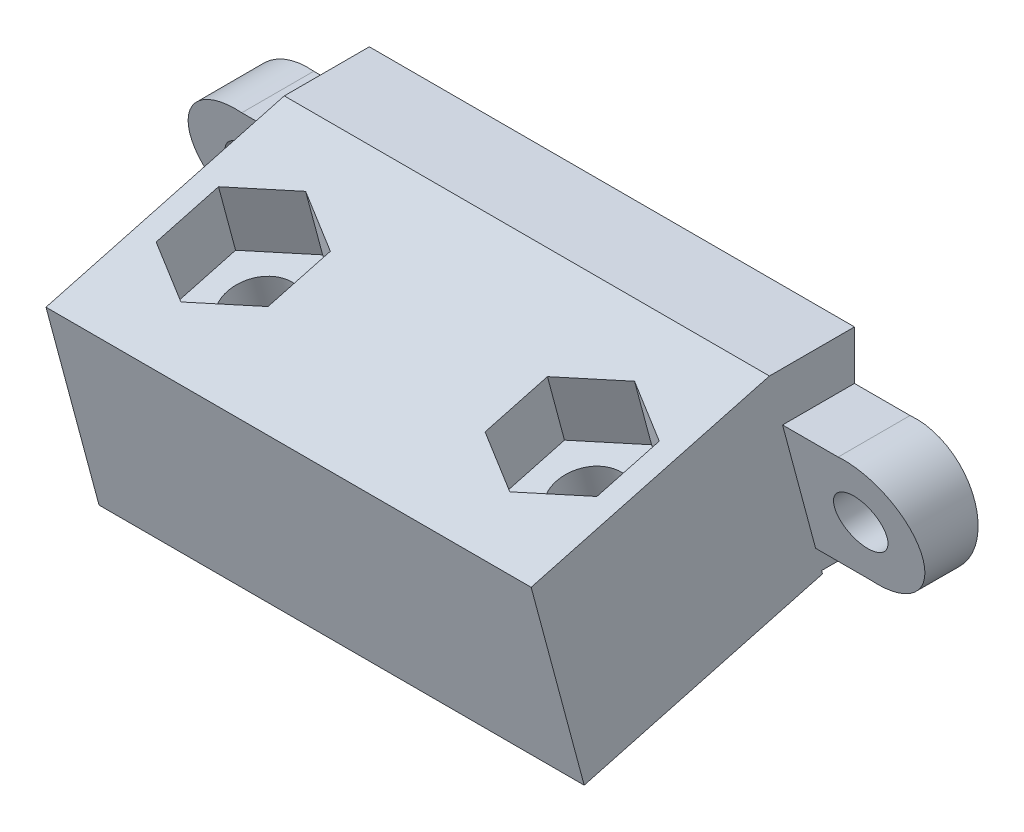
ISO-10303-21;
HEADER;
FILE_DESCRIPTION(('STEP AP214'),'2;1');
FILE_NAME('part.step','',(''),(''),'','','');
FILE_SCHEMA(('AUTOMOTIVE_DESIGN { 1 0 10303 214 1 1 1 1 }'));
ENDSEC;
DATA;
#1=APPLICATION_CONTEXT('core data for automotive mechanical design processes');
#2=APPLICATION_PROTOCOL_DEFINITION('international standard','automotive_design',2000,#1);
#3=PRODUCT_CONTEXT('',#1,'mechanical');
#4=PRODUCT('Part','Part','',(#3));
#5=PRODUCT_RELATED_PRODUCT_CATEGORY('part','',(#4));
#6=PRODUCT_DEFINITION_FORMATION('','',#4);
#7=PRODUCT_DEFINITION_CONTEXT('part definition',#1,'design');
#8=PRODUCT_DEFINITION('design','',#6,#7);
#9=PRODUCT_DEFINITION_SHAPE('','',#8);
#10=(LENGTH_UNIT() NAMED_UNIT(*) SI_UNIT(.MILLI.,.METRE.));
#11=(NAMED_UNIT(*) PLANE_ANGLE_UNIT() SI_UNIT($,.RADIAN.));
#12=(NAMED_UNIT(*) SI_UNIT($,.STERADIAN.) SOLID_ANGLE_UNIT());
#13=UNCERTAINTY_MEASURE_WITH_UNIT(LENGTH_MEASURE(1.E-05),#10,'distance_accuracy_value','');
#14=(GEOMETRIC_REPRESENTATION_CONTEXT(3) GLOBAL_UNCERTAINTY_ASSIGNED_CONTEXT((#13)) GLOBAL_UNIT_ASSIGNED_CONTEXT((#10,
#11,#12)) REPRESENTATION_CONTEXT('',''));
#15=CARTESIAN_POINT('',(0.,0.,0.));
#16=DIRECTION('',(0.,0.,1.));
#17=DIRECTION('',(1.,0.,0.));
#18=AXIS2_PLACEMENT_3D('',#15,#16,#17);
#19=CARTESIAN_POINT('',(-4.75000000000006,10.2662464495213,12.2025071457582));
#20=DIRECTION('',(0.,-0.965925826289068,-0.25881904510252));
#21=DIRECTION('',(0.,0.25881904510252,-0.965925826289068));
#22=AXIS2_PLACEMENT_3D('',#19,#20,#21);
#23=CYLINDRICAL_SURFACE('',#22,2.);
#24=CARTESIAN_POINT('',(-4.75000000000005,-0.97536344832324,9.19032685200501));
#25=DIRECTION('',(0.,0.965925826289068,0.25881904510252));
#26=DIRECTION('',(0.,-0.25881904510252,0.965925826289068));
#27=AXIS2_PLACEMENT_3D('',#24,#25,#26);
#28=CIRCLE('',#27,2.);
#29=CARTESIAN_POINT('',(-4.75000000000005,-1.49300153852828,11.1221785045831));
#30=VERTEX_POINT('',#29);
#31=EDGE_CURVE('E331',#30,#30,#28,.T.);
#32=ORIENTED_EDGE('',*,*,#31,.F.);
#33=EDGE_LOOP('',(#32));
#34=FACE_BOUND('',#33,.T.);
#35=CARTESIAN_POINT('',(-4.75000000000005,7.19515385657483,11.379610365597));
#36=DIRECTION('',(0.,0.965925826289068,0.25881904510252));
#37=DIRECTION('',(0.,-0.25881904510252,0.965925826289069));
#38=AXIS2_PLACEMENT_3D('',#35,#36,#37);
#39=CIRCLE('',#38,2.);
#40=CARTESIAN_POINT('',(-4.75000000000005,6.67751576636979,13.3114620181751));
#41=VERTEX_POINT('',#40);
#42=EDGE_CURVE('E40',#41,#41,#39,.T.);
#43=ORIENTED_EDGE('',*,*,#42,.T.);
#44=EDGE_LOOP('',(#43));
#45=FACE_BOUND('',#44,.T.);
#46=ADVANCED_FACE('F36',(#34,#45),#23,.F.);
#47=CARTESIAN_POINT('',(-24.7500000000001,10.2662464495213,12.2025071457582));
#48=DIRECTION('',(0.,-0.965925826289068,-0.25881904510252));
#49=DIRECTION('',(0.,0.25881904510252,-0.965925826289068));
#50=AXIS2_PLACEMENT_3D('',#47,#48,#49);
#51=CYLINDRICAL_SURFACE('',#50,2.);
#52=CARTESIAN_POINT('',(-24.7500000000001,-0.975363448323251,9.19032685200501));
#53=DIRECTION('',(0.,0.965925826289068,0.25881904510252));
#54=DIRECTION('',(0.,-0.25881904510252,0.965925826289068));
#55=AXIS2_PLACEMENT_3D('',#52,#53,#54);
#56=CIRCLE('',#55,2.);
#57=CARTESIAN_POINT('',(-24.7500000000001,-1.49300153852829,11.1221785045831));
#58=VERTEX_POINT('',#57);
#59=EDGE_CURVE('E328',#58,#58,#56,.T.);
#60=ORIENTED_EDGE('',*,*,#59,.F.);
#61=EDGE_LOOP('',(#60));
#62=FACE_BOUND('',#61,.T.);
#63=CARTESIAN_POINT('',(-24.7500000000001,7.19515385657482,11.379610365597));
#64=DIRECTION('',(0.,0.965925826289068,0.258819045102521));
#65=DIRECTION('',(0.,-0.258819045102521,0.965925826289068));
#66=AXIS2_PLACEMENT_3D('',#63,#64,#65);
#67=CIRCLE('',#66,2.);
#68=CARTESIAN_POINT('',(-24.7500000000001,6.67751576636978,13.3114620181751));
#69=VERTEX_POINT('',#68);
#70=EDGE_CURVE('E266',#69,#69,#67,.T.);
#71=ORIENTED_EDGE('',*,*,#70,.T.);
#72=EDGE_LOOP('',(#71));
#73=FACE_BOUND('',#72,.T.);
#74=ADVANCED_FACE('F464',(#62,#73),#51,.F.);
#75=CARTESIAN_POINT('',(0.,12.2073892877903,4.95806344859016));
#76=DIRECTION('',(0.,-0.25881904510252,0.965925826289068));
#77=DIRECTION('',(0.,-0.965925826289068,-0.25881904510252));
#78=AXIS2_PLACEMENT_3D('',#75,#76,#77);
#79=PLANE('',#78);
#80=DIRECTION('',(0.,-0.965925826289068,-0.25881904510252));
#81=VECTOR('',#80,1.);
#82=CARTESIAN_POINT('',(-29.5000000000001,12.2073892877902,4.95806344859015));
#83=LINE('',#82,#81);
#84=CARTESIAN_POINT('',(-29.5000000000001,10.0231235315044,4.37279120313842));
#85=VERTEX_POINT('',#84);
#86=CARTESIAN_POINT('',(-29.5000000000001,2.52312353150436,2.36317225990499));
#87=VERTEX_POINT('',#86);
#88=EDGE_CURVE('E11',#85,#87,#83,.T.);
#89=ORIENTED_EDGE('',*,*,#88,.F.);
#90=DIRECTION('',(-1.,0.,0.));
#91=VECTOR('',#90,1.);
#92=CARTESIAN_POINT('',(-32.88,10.0231235315044,4.3727912031384));
#93=LINE('',#92,#91);
#94=CARTESIAN_POINT('',(-32.88,10.0231235315044,4.3727912031384));
#95=VERTEX_POINT('',#94);
#96=EDGE_CURVE('E365',#85,#95,#93,.T.);
#97=ORIENTED_EDGE('',*,*,#96,.T.);
#98=CARTESIAN_POINT('',(-33.2500000000001,6.27312353150437,3.3679817315217));
#99=DIRECTION('',(0.,-0.25881904510252,0.965925826289068));
#100=DIRECTION('',(0.,-0.965925826289068,-0.25881904510252));
#101=AXIS2_PLACEMENT_3D('',#98,#99,#100);
#102=ELLIPSE('',#101,3.90113714857937,3.76820912370851);
#103=CARTESIAN_POINT('',(-32.88,2.52312353150437,2.363172259905));
#104=VERTEX_POINT('',#103);
#105=EDGE_CURVE('E362',#95,#104,#102,.T.);
#106=ORIENTED_EDGE('',*,*,#105,.T.);
#107=DIRECTION('',(1.,0.,0.));
#108=VECTOR('',#107,1.);
#109=CARTESIAN_POINT('',(-29.5000000000001,2.52312353150436,2.36317225990499));
#110=LINE('',#109,#108);
#111=EDGE_CURVE('E359',#104,#87,#110,.T.);
#112=ORIENTED_EDGE('',*,*,#111,.T.);
#113=EDGE_LOOP('',(#89,#97,#106,#112));
#114=FACE_BOUND('',#113,.T.);
#115=CARTESIAN_POINT('',(-33.2500000000001,6.27312353150437,3.3679817315217));
#116=DIRECTION('',(0.,-0.25881904510252,0.965925826289068));
#117=DIRECTION('',(0.,-0.965925826289068,-0.25881904510252));
#118=AXIS2_PLACEMENT_3D('',#115,#116,#117);
#119=ELLIPSE('',#118,1.65644188865612,1.59999999999999);
#120=CARTESIAN_POINT('',(-33.2500000000001,4.67312353150438,2.9392630236319));
#121=VERTEX_POINT('',#120);
#122=EDGE_CURVE('E353',#121,#121,#119,.T.);
#123=ORIENTED_EDGE('',*,*,#122,.F.);
#124=EDGE_LOOP('',(#123));
#125=FACE_BOUND('',#124,.T.);
#126=ADVANCED_FACE('F470',(#114,#125),#79,.T.);
#127=CARTESIAN_POINT('',(3.74999999999994,6.27312353150435,3.36798173152169));
#128=DIRECTION('',(0.,-0.25881904510252,0.965925826289068));
#129=DIRECTION('',(0.,-0.965925826289068,-0.25881904510252));
#130=AXIS2_PLACEMENT_3D('',#127,#128,#129);
#131=ELLIPSE('',#130,1.65644188865612,1.59999999999999);
#132=CARTESIAN_POINT('',(3.74999999999994,4.67312353150437,2.9392630236319));
#133=VERTEX_POINT('',#132);
#134=EDGE_CURVE('E352',#133,#133,#131,.T.);
#135=ORIENTED_EDGE('',*,*,#134,.F.);
#136=EDGE_LOOP('',(#135));
#137=FACE_BOUND('',#136,.T.);
#138=DIRECTION('',(-1.,0.,0.));
#139=VECTOR('',#138,1.);
#140=CARTESIAN_POINT('',(0.,10.0231235315044,4.3727912031384));
#141=LINE('',#140,#139);
#142=CARTESIAN_POINT('',(3.3799999999999,10.0231235315044,4.37279120313841));
#143=VERTEX_POINT('',#142);
#144=CARTESIAN_POINT('',(0.,10.0231235315044,4.3727912031384));
#145=VERTEX_POINT('',#144);
#146=EDGE_CURVE('E371',#143,#145,#141,.T.);
#147=ORIENTED_EDGE('',*,*,#146,.T.);
#148=DIRECTION('',(0.,-0.965925826289068,-0.25881904510252));
#149=VECTOR('',#148,1.);
#150=CARTESIAN_POINT('',(0.,12.2073892877903,4.95806344859016));
#151=LINE('',#150,#149);
#152=CARTESIAN_POINT('',(0.,2.52312353150435,2.36317225990498));
#153=VERTEX_POINT('',#152);
#154=EDGE_CURVE('E45',#145,#153,#151,.T.);
#155=ORIENTED_EDGE('',*,*,#154,.T.);
#156=DIRECTION('',(1.,0.,0.));
#157=VECTOR('',#156,1.);
#158=CARTESIAN_POINT('',(3.37999999999987,2.52312353150435,2.36317225990498));
#159=LINE('',#158,#157);
#160=CARTESIAN_POINT('',(3.37999999999988,2.52312353150435,2.36317225990498));
#161=VERTEX_POINT('',#160);
#162=EDGE_CURVE('E356',#153,#161,#159,.T.);
#163=ORIENTED_EDGE('',*,*,#162,.T.);
#164=CARTESIAN_POINT('',(3.74999999999994,6.27312353150435,3.36798173152169));
#165=DIRECTION('',(0.,-0.25881904510252,0.965925826289068));
#166=DIRECTION('',(0.,-0.965925826289068,-0.25881904510252));
#167=AXIS2_PLACEMENT_3D('',#164,#165,#166);
#168=ELLIPSE('',#167,3.90113714857937,3.76820912370851);
#169=EDGE_CURVE('E374',#161,#143,#168,.T.);
#170=ORIENTED_EDGE('',*,*,#169,.T.);
#171=EDGE_LOOP('',(#147,#155,#163,#170));
#172=FACE_BOUND('',#171,.T.);
#173=ADVANCED_FACE('F492',(#137,#172),#79,.T.);
#174=CARTESIAN_POINT('',(3.74999999999994,6.27312353150435,0.));
#175=DIRECTION('',(0.,0.,-1.));
#176=DIRECTION('',(-1.,0.,0.));
#177=AXIS2_PLACEMENT_3D('',#174,#175,#176);
#178=PLANE('',#177);
#179=CARTESIAN_POINT('',(-33.2500000000001,6.27312353150437,0.));
#180=DIRECTION('',(0.,0.,1.));
#181=DIRECTION('',(1.,0.,0.));
#182=AXIS2_PLACEMENT_3D('',#179,#180,#181);
#183=CIRCLE('',#182,1.59999999999999);
#184=CARTESIAN_POINT('',(-31.6500000000001,6.27312353150437,0.));
#185=VERTEX_POINT('',#184);
#186=EDGE_CURVE('E382',#185,#185,#183,.T.);
#187=ORIENTED_EDGE('',*,*,#186,.T.);
#188=EDGE_LOOP('',(#187));
#189=FACE_BOUND('',#188,.T.);
#190=CARTESIAN_POINT('',(3.74999999999994,6.27312353150435,0.));
#191=DIRECTION('',(0.,0.,1.));
#192=DIRECTION('',(-1.,0.,0.));
#193=AXIS2_PLACEMENT_3D('',#190,#191,#192);
#194=CIRCLE('',#193,3.76820912370851);
#195=CARTESIAN_POINT('',(3.37999999999988,2.52312353150435,0.));
#196=VERTEX_POINT('',#195);
#197=CARTESIAN_POINT('',(3.3799999999999,10.0231235315044,0.));
#198=VERTEX_POINT('',#197);
#199=EDGE_CURVE('E385',#196,#198,#194,.T.);
#200=ORIENTED_EDGE('',*,*,#199,.F.);
#201=DIRECTION('',(1.,0.,0.));
#202=VECTOR('',#201,1.);
#203=CARTESIAN_POINT('',(3.37999999999988,2.52312353150435,0.));
#204=LINE('',#203,#202);
#205=CARTESIAN_POINT('',(0.,2.52312353150435,0.));
#206=VERTEX_POINT('',#205);
#207=EDGE_CURVE('E390',#206,#196,#204,.T.);
#208=ORIENTED_EDGE('',*,*,#207,.F.);
#209=DIRECTION('',(0.,1.,0.));
#210=VECTOR('',#209,1.);
#211=CARTESIAN_POINT('',(0.,2.52312353150435,0.));
#212=LINE('',#211,#210);
#213=CARTESIAN_POINT('',(0.,1.16774620563937,0.));
#214=VERTEX_POINT('',#213);
#215=EDGE_CURVE('E411',#214,#206,#212,.T.);
#216=ORIENTED_EDGE('',*,*,#215,.F.);
#217=DIRECTION('',(1.,0.,0.));
#218=VECTOR('',#217,1.);
#219=CARTESIAN_POINT('',(0.,1.16774620563937,0.));
#220=LINE('',#219,#218);
#221=CARTESIAN_POINT('',(-29.5000000000001,1.16774620563936,0.));
#222=VERTEX_POINT('',#221);
#223=EDGE_CURVE('E409',#222,#214,#220,.T.);
#224=ORIENTED_EDGE('',*,*,#223,.F.);
#225=DIRECTION('',(0.,-1.,0.));
#226=VECTOR('',#225,1.);
#227=CARTESIAN_POINT('',(-29.5000000000001,1.16774620563936,0.));
#228=LINE('',#227,#226);
#229=CARTESIAN_POINT('',(-29.5000000000001,2.52312353150436,0.));
#230=VERTEX_POINT('',#229);
#231=EDGE_CURVE('E407',#230,#222,#228,.T.);
#232=ORIENTED_EDGE('',*,*,#231,.F.);
#233=DIRECTION('',(1.,0.,0.));
#234=VECTOR('',#233,1.);
#235=CARTESIAN_POINT('',(-29.5000000000001,2.52312353150436,0.));
#236=LINE('',#235,#234);
#237=CARTESIAN_POINT('',(-32.88,2.52312353150437,0.));
#238=VERTEX_POINT('',#237);
#239=EDGE_CURVE('E405',#238,#230,#236,.T.);
#240=ORIENTED_EDGE('',*,*,#239,.F.);
#241=CARTESIAN_POINT('',(-33.2500000000001,6.27312353150437,0.));
#242=DIRECTION('',(0.,0.,1.));
#243=DIRECTION('',(1.,0.,0.));
#244=AXIS2_PLACEMENT_3D('',#241,#242,#243);
#245=CIRCLE('',#244,3.76820912370851);
#246=CARTESIAN_POINT('',(-32.88,10.0231235315044,0.));
#247=VERTEX_POINT('',#246);
#248=EDGE_CURVE('E403',#247,#238,#245,.T.);
#249=ORIENTED_EDGE('',*,*,#248,.F.);
#250=DIRECTION('',(-1.,0.,0.));
#251=VECTOR('',#250,1.);
#252=CARTESIAN_POINT('',(-32.88,10.0231235315044,0.));
#253=LINE('',#252,#251);
#254=CARTESIAN_POINT('',(-29.5000000000001,10.0231235315044,0.));
#255=VERTEX_POINT('',#254);
#256=EDGE_CURVE('E401',#255,#247,#253,.T.);
#257=ORIENTED_EDGE('',*,*,#256,.F.);
#258=DIRECTION('',(0.,-1.,0.));
#259=VECTOR('',#258,1.);
#260=CARTESIAN_POINT('',(-29.5000000000001,10.0231235315044,0.));
#261=LINE('',#260,#259);
#262=CARTESIAN_POINT('',(-29.5000000000001,13.,0.));
#263=VERTEX_POINT('',#262);
#264=EDGE_CURVE('E399',#263,#255,#261,.T.);
#265=ORIENTED_EDGE('',*,*,#264,.F.);
#266=DIRECTION('',(-1.,0.,0.));
#267=VECTOR('',#266,1.);
#268=CARTESIAN_POINT('',(-29.5000000000001,13.,0.));
#269=LINE('',#268,#267);
#270=CARTESIAN_POINT('',(0.,13.,0.));
#271=VERTEX_POINT('',#270);
#272=EDGE_CURVE('E397',#271,#263,#269,.T.);
#273=ORIENTED_EDGE('',*,*,#272,.F.);
#274=DIRECTION('',(0.,1.,0.));
#275=VECTOR('',#274,1.);
#276=CARTESIAN_POINT('',(0.,13.,0.));
#277=LINE('',#276,#275);
#278=CARTESIAN_POINT('',(0.,10.0231235315044,0.));
#279=VERTEX_POINT('',#278);
#280=EDGE_CURVE('E395',#279,#271,#277,.T.);
#281=ORIENTED_EDGE('',*,*,#280,.F.);
#282=DIRECTION('',(-1.,0.,0.));
#283=VECTOR('',#282,1.);
#284=CARTESIAN_POINT('',(0.,10.0231235315044,0.));
#285=LINE('',#284,#283);
#286=EDGE_CURVE('E393',#198,#279,#285,.T.);
#287=ORIENTED_EDGE('',*,*,#286,.F.);
#288=EDGE_LOOP('',(#200,#208,#216,#224,#232,#240,#249,#257,#265,#273,#281,#287));
#289=FACE_BOUND('',#288,.T.);
#290=CARTESIAN_POINT('',(3.74999999999994,6.27312353150435,0.));
#291=DIRECTION('',(0.,0.,1.));
#292=DIRECTION('',(1.,0.,0.));
#293=AXIS2_PLACEMENT_3D('',#290,#291,#292);
#294=CIRCLE('',#293,1.59999999999999);
#295=CARTESIAN_POINT('',(5.34999999999993,6.27312353150435,0.));
#296=VERTEX_POINT('',#295);
#297=EDGE_CURVE('E377',#296,#296,#294,.T.);
#298=ORIENTED_EDGE('',*,*,#297,.T.);
#299=EDGE_LOOP('',(#298));
#300=FACE_BOUND('',#299,.T.);
#301=ADVANCED_FACE('F502',(#189,#289,#300),#178,.T.);
#302=CARTESIAN_POINT('',(3.74999999999994,6.27312353150435,2.));
#303=DIRECTION('',(0.,0.,-1.));
#304=DIRECTION('',(-1.,0.,0.));
#305=AXIS2_PLACEMENT_3D('',#302,#303,#304);
#306=CYLINDRICAL_SURFACE('',#305,3.76820912370851);
#307=ORIENTED_EDGE('',*,*,#199,.T.);
#308=DIRECTION('',(0.,0.,-1.));
#309=VECTOR('',#308,1.);
#310=CARTESIAN_POINT('',(3.3799999999999,10.0231235315044,2.));
#311=LINE('',#310,#309);
#312=EDGE_CURVE('E446',#143,#198,#311,.T.);
#313=ORIENTED_EDGE('',*,*,#312,.F.);
#314=ORIENTED_EDGE('',*,*,#169,.F.);
#315=DIRECTION('',(0.,0.,-1.));
#316=VECTOR('',#315,1.);
#317=CARTESIAN_POINT('',(3.37999999999988,2.52312353150435,2.));
#318=LINE('',#317,#316);
#319=EDGE_CURVE('E389',#161,#196,#318,.T.);
#320=ORIENTED_EDGE('',*,*,#319,.T.);
#321=EDGE_LOOP('',(#307,#313,#314,#320));
#322=FACE_BOUND('',#321,.T.);
#323=ADVANCED_FACE('F38',(#322),#306,.T.);
#324=CARTESIAN_POINT('',(0.,10.0231235315044,2.));
#325=DIRECTION('',(0.,-1.,0.));
#326=DIRECTION('',(1.,0.,0.));
#327=AXIS2_PLACEMENT_3D('',#324,#325,#326);
#328=PLANE('',#327);
#329=ORIENTED_EDGE('',*,*,#286,.T.);
#330=DIRECTION('',(0.,0.,-1.));
#331=VECTOR('',#330,1.);
#332=CARTESIAN_POINT('',(0.,10.0231235315044,2.));
#333=LINE('',#332,#331);
#334=EDGE_CURVE('E443',#145,#279,#333,.T.);
#335=ORIENTED_EDGE('',*,*,#334,.F.);
#336=ORIENTED_EDGE('',*,*,#146,.F.);
#337=ORIENTED_EDGE('',*,*,#312,.T.);
#338=EDGE_LOOP('',(#329,#335,#336,#337));
#339=FACE_BOUND('',#338,.T.);
#340=ADVANCED_FACE('F535',(#339),#328,.F.);
#341=CARTESIAN_POINT('',(-29.5000000000001,13.,2.));
#342=DIRECTION('',(0.,-1.,0.));
#343=DIRECTION('',(1.,0.,0.));
#344=AXIS2_PLACEMENT_3D('',#341,#342,#343);
#345=PLANE('',#344);
#346=ORIENTED_EDGE('',*,*,#272,.T.);
#347=DIRECTION('',(0.,0.,-1.));
#348=VECTOR('',#347,1.);
#349=CARTESIAN_POINT('',(-29.5000000000001,13.,2.));
#350=LINE('',#349,#348);
#351=CARTESIAN_POINT('',(-29.5000000000001,13.,5.17044284883903));
#352=VERTEX_POINT('',#351);
#353=EDGE_CURVE('E437',#352,#263,#350,.T.);
#354=ORIENTED_EDGE('',*,*,#353,.F.);
#355=DIRECTION('',(-1.,0.,0.));
#356=VECTOR('',#355,1.);
#357=CARTESIAN_POINT('',(-29.5000000000001,13.,5.17044284883902));
#358=LINE('',#357,#356);
#359=CARTESIAN_POINT('',(0.,13.,5.17044284883903));
#360=VERTEX_POINT('',#359);
#361=EDGE_CURVE('E368',#360,#352,#358,.T.);
#362=ORIENTED_EDGE('',*,*,#361,.F.);
#363=DIRECTION('',(0.,0.,-1.));
#364=VECTOR('',#363,1.);
#365=CARTESIAN_POINT('',(0.,13.,2.));
#366=LINE('',#365,#364);
#367=EDGE_CURVE('E440',#360,#271,#366,.T.);
#368=ORIENTED_EDGE('',*,*,#367,.T.);
#369=EDGE_LOOP('',(#346,#354,#362,#368));
#370=FACE_BOUND('',#369,.T.);
#371=ADVANCED_FACE('F532',(#370),#345,.F.);
#372=CARTESIAN_POINT('',(-32.88,10.0231235315044,2.));
#373=DIRECTION('',(0.,-1.,0.));
#374=DIRECTION('',(0.,0.,-1.));
#375=AXIS2_PLACEMENT_3D('',#372,#373,#374);
#376=PLANE('',#375);
#377=ORIENTED_EDGE('',*,*,#256,.T.);
#378=DIRECTION('',(0.,0.,-1.));
#379=VECTOR('',#378,1.);
#380=CARTESIAN_POINT('',(-32.88,10.0231235315044,2.));
#381=LINE('',#380,#379);
#382=EDGE_CURVE('E431',#95,#247,#381,.T.);
#383=ORIENTED_EDGE('',*,*,#382,.F.);
#384=ORIENTED_EDGE('',*,*,#96,.F.);
#385=DIRECTION('',(0.,0.,-1.));
#386=VECTOR('',#385,1.);
#387=CARTESIAN_POINT('',(-29.5000000000001,10.0231235315044,2.));
#388=LINE('',#387,#386);
#389=EDGE_CURVE('E434',#85,#255,#388,.T.);
#390=ORIENTED_EDGE('',*,*,#389,.T.);
#391=EDGE_LOOP('',(#377,#383,#384,#390));
#392=FACE_BOUND('',#391,.T.);
#393=ADVANCED_FACE('F528',(#392),#376,.F.);
#394=CARTESIAN_POINT('',(-33.2500000000001,6.27312353150437,2.));
#395=DIRECTION('',(0.,0.,-1.));
#396=DIRECTION('',(-1.,0.,0.));
#397=AXIS2_PLACEMENT_3D('',#394,#395,#396);
#398=CYLINDRICAL_SURFACE('',#397,3.76820912370851);
#399=ORIENTED_EDGE('',*,*,#248,.T.);
#400=DIRECTION('',(0.,0.,-1.));
#401=VECTOR('',#400,1.);
#402=CARTESIAN_POINT('',(-32.88,2.52312353150437,2.));
#403=LINE('',#402,#401);
#404=EDGE_CURVE('E428',#104,#238,#403,.T.);
#405=ORIENTED_EDGE('',*,*,#404,.F.);
#406=ORIENTED_EDGE('',*,*,#105,.F.);
#407=ORIENTED_EDGE('',*,*,#382,.T.);
#408=EDGE_LOOP('',(#399,#405,#406,#407));
#409=FACE_BOUND('',#408,.T.);
#410=ADVANCED_FACE('F524',(#409),#398,.T.);
#411=CARTESIAN_POINT('',(-29.5000000000001,2.52312353150436,2.));
#412=DIRECTION('',(0.,1.,0.));
#413=DIRECTION('',(-1.,0.,0.));
#414=AXIS2_PLACEMENT_3D('',#411,#412,#413);
#415=PLANE('',#414);
#416=ORIENTED_EDGE('',*,*,#239,.T.);
#417=DIRECTION('',(0.,0.,-1.));
#418=VECTOR('',#417,1.);
#419=CARTESIAN_POINT('',(-29.5000000000001,2.52312353150436,2.));
#420=LINE('',#419,#418);
#421=EDGE_CURVE('E425',#87,#230,#420,.T.);
#422=ORIENTED_EDGE('',*,*,#421,.F.);
#423=ORIENTED_EDGE('',*,*,#111,.F.);
#424=ORIENTED_EDGE('',*,*,#404,.T.);
#425=EDGE_LOOP('',(#416,#422,#423,#424));
#426=FACE_BOUND('',#425,.T.);
#427=ADVANCED_FACE('F520',(#426),#415,.F.);
#428=CARTESIAN_POINT('',(-29.5000000000001,1.16774620563936,2.));
#429=DIRECTION('',(1.,0.,0.));
#430=DIRECTION('',(0.,0.,-1.));
#431=AXIS2_PLACEMENT_3D('',#428,#429,#430);
#432=PLANE('',#431);
#433=ORIENTED_EDGE('',*,*,#389,.F.);
#434=ORIENTED_EDGE('',*,*,#88,.T.);
#435=ORIENTED_EDGE('',*,*,#421,.T.);
#436=ORIENTED_EDGE('',*,*,#231,.T.);
#437=DIRECTION('',(0.,0.,-1.));
#438=VECTOR('',#437,1.);
#439=CARTESIAN_POINT('',(-29.5000000000001,1.16774620563936,2.));
#440=LINE('',#439,#438);
#441=CARTESIAN_POINT('',(-29.5000000000001,1.16774620563936,2.));
#442=VERTEX_POINT('',#441);
#443=EDGE_CURVE('E422',#442,#222,#440,.T.);
#444=ORIENTED_EDGE('',*,*,#443,.F.);
#445=CARTESIAN_POINT('',(-29.5000000000001,0.965779389945652,1.94588315483699));
#446=VERTEX_POINT('',#445);
#447=EDGE_CURVE('E47',#442,#446,#83,.T.);
#448=ORIENTED_EDGE('',*,*,#447,.T.);
#449=DIRECTION('',(0.,-0.25881904510252,0.965925826289068));
#450=VECTOR('',#449,1.);
#451=CARTESIAN_POINT('',(-29.5000000000001,0.965779389945652,1.94588315483699));
#452=LINE('',#451,#450);
#453=CARTESIAN_POINT('',(-29.5,-2.91650628659216,16.434770549173));
#454=VERTEX_POINT('',#453);
#455=EDGE_CURVE('E340',#446,#454,#452,.T.);
#456=ORIENTED_EDGE('',*,*,#455,.T.);
#457=DIRECTION('',(0.,-0.965925826289068,-0.25881904510252));
#458=VECTOR('',#457,1.);
#459=CARTESIAN_POINT('',(-29.5000000000001,8.32510361125243,19.4469508429262));
#460=LINE('',#459,#458);
#461=CARTESIAN_POINT('',(-29.5000000000001,9.11771432346218,19.659330243175));
#462=VERTEX_POINT('',#461);
#463=EDGE_CURVE('E347',#462,#454,#460,.T.);
#464=ORIENTED_EDGE('',*,*,#463,.F.);
#465=DIRECTION('',(0.,-0.25881904510252,0.965925826289068));
#466=VECTOR('',#465,1.);
#467=CARTESIAN_POINT('',(-29.5000000000001,13.,5.17044284883901));
#468=LINE('',#467,#466);
#469=EDGE_CURVE('E322',#352,#462,#468,.T.);
#470=ORIENTED_EDGE('',*,*,#469,.F.);
#471=ORIENTED_EDGE('',*,*,#353,.T.);
#472=ORIENTED_EDGE('',*,*,#264,.T.);
#473=EDGE_LOOP('',(#433,#434,#435,#436,#444,#448,#456,#464,#470,#471,#472));
#474=FACE_BOUND('',#473,.T.);
#475=ADVANCED_FACE('F516',(#474),#432,.F.);
#476=CARTESIAN_POINT('',(0.,1.16774620563937,2.));
#477=DIRECTION('',(0.,1.,0.));
#478=DIRECTION('',(-1.,0.,0.));
#479=AXIS2_PLACEMENT_3D('',#476,#477,#478);
#480=PLANE('',#479);
#481=ORIENTED_EDGE('',*,*,#223,.T.);
#482=DIRECTION('',(0.,0.,-1.));
#483=VECTOR('',#482,1.);
#484=CARTESIAN_POINT('',(0.,1.16774620563937,2.));
#485=LINE('',#484,#483);
#486=CARTESIAN_POINT('',(0.,1.16774620563937,2.00000000000001));
#487=VERTEX_POINT('',#486);
#488=EDGE_CURVE('E419',#487,#214,#485,.T.);
#489=ORIENTED_EDGE('',*,*,#488,.F.);
#490=DIRECTION('',(1.,0.,0.));
#491=VECTOR('',#490,1.);
#492=CARTESIAN_POINT('',(0.,1.16774620563937,2.));
#493=LINE('',#492,#491);
#494=EDGE_CURVE('E386',#442,#487,#493,.T.);
#495=ORIENTED_EDGE('',*,*,#494,.F.);
#496=ORIENTED_EDGE('',*,*,#443,.T.);
#497=EDGE_LOOP('',(#481,#489,#495,#496));
#498=FACE_BOUND('',#497,.T.);
#499=ADVANCED_FACE('F512',(#498),#480,.F.);
#500=CARTESIAN_POINT('',(0.,2.52312353150435,2.));
#501=DIRECTION('',(-1.,0.,0.));
#502=DIRECTION('',(0.,-1.,0.));
#503=AXIS2_PLACEMENT_3D('',#500,#501,#502);
#504=PLANE('',#503);
#505=CARTESIAN_POINT('',(0.,0.965779389945666,1.94588315483699));
#506=VERTEX_POINT('',#505);
#507=EDGE_CURVE('E350',#487,#506,#151,.T.);
#508=ORIENTED_EDGE('',*,*,#507,.F.);
#509=ORIENTED_EDGE('',*,*,#488,.T.);
#510=ORIENTED_EDGE('',*,*,#215,.T.);
#511=DIRECTION('',(0.,0.,-1.));
#512=VECTOR('',#511,1.);
#513=CARTESIAN_POINT('',(0.,2.52312353150435,2.));
#514=LINE('',#513,#512);
#515=EDGE_CURVE('E416',#153,#206,#514,.T.);
#516=ORIENTED_EDGE('',*,*,#515,.F.);
#517=ORIENTED_EDGE('',*,*,#154,.F.);
#518=ORIENTED_EDGE('',*,*,#334,.T.);
#519=ORIENTED_EDGE('',*,*,#280,.T.);
#520=ORIENTED_EDGE('',*,*,#367,.F.);
#521=DIRECTION('',(0.,0.25881904510252,-0.965925826289068));
#522=VECTOR('',#521,1.);
#523=CARTESIAN_POINT('',(0.,13.,5.17044284883902));
#524=LINE('',#523,#522);
#525=CARTESIAN_POINT('',(0.,9.1177143234622,19.659330243175));
#526=VERTEX_POINT('',#525);
#527=EDGE_CURVE('E319',#526,#360,#524,.T.);
#528=ORIENTED_EDGE('',*,*,#527,.F.);
#529=DIRECTION('',(0.,-0.965925826289068,-0.25881904510252));
#530=VECTOR('',#529,1.);
#531=CARTESIAN_POINT('',(0.,8.32510361125244,19.4469508429262));
#532=LINE('',#531,#530);
#533=CARTESIAN_POINT('',(0.,-2.91650628659214,16.434770549173));
#534=VERTEX_POINT('',#533);
#535=EDGE_CURVE('E344',#526,#534,#532,.T.);
#536=ORIENTED_EDGE('',*,*,#535,.T.);
#537=DIRECTION('',(0.,0.25881904510252,-0.965925826289068));
#538=VECTOR('',#537,1.);
#539=CARTESIAN_POINT('',(0.,0.965779389945666,1.94588315483699));
#540=LINE('',#539,#538);
#541=EDGE_CURVE('E334',#534,#506,#540,.T.);
#542=ORIENTED_EDGE('',*,*,#541,.T.);
#543=EDGE_LOOP('',(#508,#509,#510,#516,#517,#518,#519,#520,#528,#536,#542));
#544=FACE_BOUND('',#543,.T.);
#545=ADVANCED_FACE('F508',(#544),#504,.F.);
#546=CARTESIAN_POINT('',(3.37999999999988,2.52312353150435,2.));
#547=DIRECTION('',(0.,1.,0.));
#548=DIRECTION('',(-1.,0.,0.));
#549=AXIS2_PLACEMENT_3D('',#546,#547,#548);
#550=PLANE('',#549);
#551=ORIENTED_EDGE('',*,*,#207,.T.);
#552=ORIENTED_EDGE('',*,*,#319,.F.);
#553=ORIENTED_EDGE('',*,*,#162,.F.);
#554=ORIENTED_EDGE('',*,*,#515,.T.);
#555=EDGE_LOOP('',(#551,#552,#553,#554));
#556=FACE_BOUND('',#555,.T.);
#557=ADVANCED_FACE('F500',(#556),#550,.F.);
#558=CARTESIAN_POINT('',(-33.2500000000001,6.27312353150437,2.));
#559=DIRECTION('',(0.,0.,-1.));
#560=DIRECTION('',(-1.,0.,0.));
#561=AXIS2_PLACEMENT_3D('',#558,#559,#560);
#562=CYLINDRICAL_SURFACE('',#561,1.59999999999999);
#563=ORIENTED_EDGE('',*,*,#186,.F.);
#564=EDGE_LOOP('',(#563));
#565=FACE_BOUND('',#564,.T.);
#566=ORIENTED_EDGE('',*,*,#122,.T.);
#567=EDGE_LOOP('',(#566));
#568=FACE_BOUND('',#567,.T.);
#569=ADVANCED_FACE('F496',(#565,#568),#562,.F.);
#570=CARTESIAN_POINT('',(3.74999999999994,6.27312353150435,2.));
#571=DIRECTION('',(0.,0.,-1.));
#572=DIRECTION('',(-1.,0.,0.));
#573=AXIS2_PLACEMENT_3D('',#570,#571,#572);
#574=CYLINDRICAL_SURFACE('',#573,1.59999999999999);
#575=ORIENTED_EDGE('',*,*,#297,.F.);
#576=EDGE_LOOP('',(#575));
#577=FACE_BOUND('',#576,.T.);
#578=ORIENTED_EDGE('',*,*,#134,.T.);
#579=EDGE_LOOP('',(#578));
#580=FACE_BOUND('',#579,.T.);
#581=ADVANCED_FACE('F488',(#577,#580),#574,.F.);
#582=CARTESIAN_POINT('',(0.,12.2073892877903,4.95806344859016));
#583=DIRECTION('',(0.,-0.25881904510252,0.965925826289068));
#584=DIRECTION('',(0.,-0.965925826289068,-0.25881904510252));
#585=AXIS2_PLACEMENT_3D('',#582,#583,#584);
#586=PLANE('',#585);
#587=ORIENTED_EDGE('',*,*,#447,.F.);
#588=ORIENTED_EDGE('',*,*,#494,.T.);
#589=ORIENTED_EDGE('',*,*,#507,.T.);
#590=DIRECTION('',(-1.,0.,0.));
#591=VECTOR('',#590,1.);
#592=CARTESIAN_POINT('',(0.,0.965779389945666,1.94588315483699));
#593=LINE('',#592,#591);
#594=EDGE_CURVE('E337',#506,#446,#593,.T.);
#595=ORIENTED_EDGE('',*,*,#594,.T.);
#596=EDGE_LOOP('',(#587,#588,#589,#595));
#597=FACE_BOUND('',#596,.T.);
#598=ADVANCED_FACE('F480',(#597),#586,.F.);
#599=CARTESIAN_POINT('',(0.,1.38755522675427,0.37179430246239));
#600=DIRECTION('',(0.,-0.965925826289069,-0.25881904510252));
#601=DIRECTION('',(0.,0.25881904510252,-0.965925826289068));
#602=AXIS2_PLACEMENT_3D('',#599,#600,#601);
#603=PLANE('',#602);
#604=ORIENTED_EDGE('',*,*,#31,.T.);
#605=EDGE_LOOP('',(#604));
#606=FACE_BOUND('',#605,.T.);
#607=ORIENTED_EDGE('',*,*,#541,.F.);
#608=DIRECTION('',(1.,0.,0.));
#609=VECTOR('',#608,1.);
#610=CARTESIAN_POINT('',(0.,-2.91650628659214,16.434770549173));
#611=LINE('',#610,#609);
#612=EDGE_CURVE('E342',#454,#534,#611,.T.);
#613=ORIENTED_EDGE('',*,*,#612,.F.);
#614=ORIENTED_EDGE('',*,*,#455,.F.);
#615=ORIENTED_EDGE('',*,*,#594,.F.);
#616=EDGE_LOOP('',(#607,#613,#614,#615));
#617=FACE_BOUND('',#616,.T.);
#618=ORIENTED_EDGE('',*,*,#59,.T.);
#619=EDGE_LOOP('',(#618));
#620=FACE_BOUND('',#619,.T.);
#621=ADVANCED_FACE('F476',(#606,#617,#620),#603,.T.);
#622=CARTESIAN_POINT('',(0.,8.32510361125244,19.4469508429262));
#623=DIRECTION('',(0.,0.25881904510252,-0.965925826289068));
#624=DIRECTION('',(0.,0.965925826289068,0.25881904510252));
#625=AXIS2_PLACEMENT_3D('',#622,#623,#624);
#626=PLANE('',#625);
#627=ORIENTED_EDGE('',*,*,#612,.T.);
#628=ORIENTED_EDGE('',*,*,#535,.F.);
#629=DIRECTION('',(1.,0.,0.));
#630=VECTOR('',#629,1.);
#631=CARTESIAN_POINT('',(0.,9.1177143234622,19.659330243175));
#632=LINE('',#631,#630);
#633=EDGE_CURVE('E325',#462,#526,#632,.T.);
#634=ORIENTED_EDGE('',*,*,#633,.F.);
#635=ORIENTED_EDGE('',*,*,#463,.T.);
#636=EDGE_LOOP('',(#627,#628,#634,#635));
#637=FACE_BOUND('',#636,.T.);
#638=ADVANCED_FACE('F479',(#637),#626,.F.);
#639=CARTESIAN_POINT('',(0.,13.4217758368086,3.59635399646442));
#640=DIRECTION('',(0.,-0.965925826289069,-0.25881904510252));
#641=DIRECTION('',(0.,0.25881904510252,-0.965925826289068));
#642=AXIS2_PLACEMENT_3D('',#639,#640,#641);
#643=PLANE('',#642);
#644=DIRECTION('',(0.,0.25881904510252,-0.965925826289068));
#645=VECTOR('',#644,1.);
#646=CARTESIAN_POINT('',(-1.35000000000005,10.5507977275025,14.3109901678127));
#647=LINE('',#646,#645);
#648=CARTESIAN_POINT('',(-1.35000000000005,10.5507977275025,14.3109901678127));
#649=VERTEX_POINT('',#648);
#650=CARTESIAN_POINT('',(-1.35000000000005,11.5669165959597,10.5187829242013));
#651=VERTEX_POINT('',#650);
#652=EDGE_CURVE('E253',#649,#651,#647,.T.);
#653=ORIENTED_EDGE('',*,*,#652,.F.);
#654=DIRECTION('',(0.866025403784438,0.129409522551261,-0.482962913144534));
#655=VECTOR('',#654,1.);
#656=CARTESIAN_POINT('',(-4.75000000000006,10.042738293274,16.2070937896184));
#657=LINE('',#656,#655);
#658=CARTESIAN_POINT('',(-4.75000000000006,10.042738293274,16.2070937896184));
#659=VERTEX_POINT('',#658);
#660=EDGE_CURVE('E54',#659,#649,#657,.T.);
#661=ORIENTED_EDGE('',*,*,#660,.F.);
#662=DIRECTION('',(0.866025403784438,-0.12940952255126,0.482962913144535));
#663=VECTOR('',#662,1.);
#664=CARTESIAN_POINT('',(-8.15000000000006,10.5507977275025,14.3109901678127));
#665=LINE('',#664,#663);
#666=CARTESIAN_POINT('',(-8.15000000000006,10.5507977275025,14.3109901678127));
#667=VERTEX_POINT('',#666);
#668=EDGE_CURVE('E239',#667,#659,#665,.T.);
#669=ORIENTED_EDGE('',*,*,#668,.F.);
#670=DIRECTION('',(0.,-0.25881904510252,0.965925826289068));
#671=VECTOR('',#670,1.);
#672=CARTESIAN_POINT('',(-8.15000000000006,11.5669165959597,10.5187829242013));
#673=LINE('',#672,#671);
#674=CARTESIAN_POINT('',(-8.15000000000006,11.5669165959597,10.5187829242013));
#675=VERTEX_POINT('',#674);
#676=EDGE_CURVE('E242',#675,#667,#673,.T.);
#677=ORIENTED_EDGE('',*,*,#676,.F.);
#678=DIRECTION('',(-0.866025403784439,-0.129409522551261,0.482962913144534));
#679=VECTOR('',#678,1.);
#680=CARTESIAN_POINT('',(-4.75000000000005,12.0749760301882,8.62267930239563));
#681=LINE('',#680,#679);
#682=CARTESIAN_POINT('',(-4.75000000000005,12.0749760301882,8.62267930239563));
#683=VERTEX_POINT('',#682);
#684=EDGE_CURVE('E259',#683,#675,#681,.T.);
#685=ORIENTED_EDGE('',*,*,#684,.F.);
#686=DIRECTION('',(-0.866025403784438,0.12940952255126,-0.482962913144535));
#687=VECTOR('',#686,1.);
#688=CARTESIAN_POINT('',(-1.35000000000005,11.5669165959597,10.5187829242013));
#689=LINE('',#688,#687);
#690=EDGE_CURVE('E256',#651,#683,#689,.T.);
#691=ORIENTED_EDGE('',*,*,#690,.F.);
#692=EDGE_LOOP('',(#653,#661,#669,#677,#685,#691));
#693=FACE_BOUND('',#692,.T.);
#694=DIRECTION('',(-0.866025403784438,0.12940952255126,-0.482962913144535));
#695=VECTOR('',#694,1.);
#696=CARTESIAN_POINT('',(-21.3500000000001,11.5669165959597,10.5187829242013));
#697=LINE('',#696,#695);
#698=CARTESIAN_POINT('',(-21.3500000000001,11.5669165959597,10.5187829242013));
#699=VERTEX_POINT('',#698);
#700=CARTESIAN_POINT('',(-24.7500000000001,12.0749760301882,8.62267930239564));
#701=VERTEX_POINT('',#700);
#702=EDGE_CURVE('E295',#699,#701,#697,.T.);
#703=ORIENTED_EDGE('',*,*,#702,.F.);
#704=DIRECTION('',(0.,0.258819045102521,-0.965925826289068));
#705=VECTOR('',#704,1.);
#706=CARTESIAN_POINT('',(-21.3500000000001,10.5507977275025,14.3109901678127));
#707=LINE('',#706,#705);
#708=CARTESIAN_POINT('',(-21.3500000000001,10.5507977275025,14.3109901678127));
#709=VERTEX_POINT('',#708);
#710=EDGE_CURVE('E62',#709,#699,#707,.T.);
#711=ORIENTED_EDGE('',*,*,#710,.F.);
#712=DIRECTION('',(0.866025403784439,0.129409522551261,-0.482962913144534));
#713=VECTOR('',#712,1.);
#714=CARTESIAN_POINT('',(-24.7500000000001,10.042738293274,16.2070937896184));
#715=LINE('',#714,#713);
#716=CARTESIAN_POINT('',(-24.7500000000001,10.042738293274,16.2070937896184));
#717=VERTEX_POINT('',#716);
#718=EDGE_CURVE('E278',#717,#709,#715,.T.);
#719=ORIENTED_EDGE('',*,*,#718,.F.);
#720=DIRECTION('',(0.866025403784438,-0.12940952255126,0.482962913144535));
#721=VECTOR('',#720,1.);
#722=CARTESIAN_POINT('',(-28.1500000000001,10.5507977275025,14.3109901678127));
#723=LINE('',#722,#721);
#724=CARTESIAN_POINT('',(-28.1500000000001,10.5507977275025,14.3109901678127));
#725=VERTEX_POINT('',#724);
#726=EDGE_CURVE('E304',#725,#717,#723,.T.);
#727=ORIENTED_EDGE('',*,*,#726,.F.);
#728=DIRECTION('',(0.,-0.25881904510252,0.965925826289068));
#729=VECTOR('',#728,1.);
#730=CARTESIAN_POINT('',(-28.1500000000001,11.5669165959597,10.5187829242013));
#731=LINE('',#730,#729);
#732=CARTESIAN_POINT('',(-28.1500000000001,11.5669165959597,10.5187829242013));
#733=VERTEX_POINT('',#732);
#734=EDGE_CURVE('E301',#733,#725,#731,.T.);
#735=ORIENTED_EDGE('',*,*,#734,.F.);
#736=DIRECTION('',(-0.866025403784439,-0.12940952255126,0.482962913144534));
#737=VECTOR('',#736,1.);
#738=CARTESIAN_POINT('',(-24.7500000000001,12.0749760301882,8.62267930239564));
#739=LINE('',#738,#737);
#740=EDGE_CURVE('E298',#701,#733,#739,.T.);
#741=ORIENTED_EDGE('',*,*,#740,.F.);
#742=EDGE_LOOP('',(#703,#711,#719,#727,#735,#741));
#743=FACE_BOUND('',#742,.T.);
#744=ORIENTED_EDGE('',*,*,#527,.T.);
#745=ORIENTED_EDGE('',*,*,#361,.T.);
#746=ORIENTED_EDGE('',*,*,#469,.T.);
#747=ORIENTED_EDGE('',*,*,#633,.T.);
#748=EDGE_LOOP('',(#744,#745,#746,#747));
#749=FACE_BOUND('',#748,.T.);
#750=ADVANCED_FACE('F484',(#693,#743,#749),#643,.F.);
#751=CARTESIAN_POINT('',(-21.3500000000001,6.68709442234626,13.2757139874027));
#752=DIRECTION('',(1.,0.,0.));
#753=DIRECTION('',(0.,1.,0.));
#754=AXIS2_PLACEMENT_3D('',#751,#752,#753);
#755=PLANE('',#754);
#756=ORIENTED_EDGE('',*,*,#710,.T.);
#757=DIRECTION('',(0.,0.965925826289068,0.25881904510252));
#758=VECTOR('',#757,1.);
#759=CARTESIAN_POINT('',(-21.3500000000001,7.70321329080339,9.48350674379126));
#760=LINE('',#759,#758);
#761=CARTESIAN_POINT('',(-21.3500000000001,7.70321329080339,9.48350674379126));
#762=VERTEX_POINT('',#761);
#763=EDGE_CURVE('E293',#762,#699,#760,.T.);
#764=ORIENTED_EDGE('',*,*,#763,.F.);
#765=DIRECTION('',(0.,0.258819045102521,-0.965925826289068));
#766=VECTOR('',#765,1.);
#767=CARTESIAN_POINT('',(-21.3500000000001,6.68709442234626,13.2757139874027));
#768=LINE('',#767,#766);
#769=CARTESIAN_POINT('',(-21.3500000000001,6.68709442234626,13.2757139874027));
#770=VERTEX_POINT('',#769);
#771=EDGE_CURVE('E274',#770,#762,#768,.T.);
#772=ORIENTED_EDGE('',*,*,#771,.F.);
#773=DIRECTION('',(0.,0.965925826289068,0.25881904510252));
#774=VECTOR('',#773,1.);
#775=CARTESIAN_POINT('',(-21.3500000000001,6.68709442234626,13.2757139874027));
#776=LINE('',#775,#774);
#777=EDGE_CURVE('E254',#770,#709,#776,.T.);
#778=ORIENTED_EDGE('',*,*,#777,.T.);
#779=EDGE_LOOP('',(#756,#764,#772,#778));
#780=FACE_BOUND('',#779,.T.);
#781=ADVANCED_FACE('F710',(#780),#755,.F.);
#782=CARTESIAN_POINT('',(-24.7500000000001,6.17903498811769,15.1718176092084));
#783=DIRECTION('',(0.5,-0.224143868042013,0.836516303737808));
#784=DIRECTION('',(0.858356263574049,0.,-0.513054114868206));
#785=AXIS2_PLACEMENT_3D('',#782,#783,#784);
#786=PLANE('',#785);
#787=ORIENTED_EDGE('',*,*,#718,.T.);
#788=ORIENTED_EDGE('',*,*,#777,.F.);
#789=DIRECTION('',(0.866025403784439,0.129409522551261,-0.482962913144534));
#790=VECTOR('',#789,1.);
#791=CARTESIAN_POINT('',(-24.7500000000001,6.17903498811769,15.1718176092084));
#792=LINE('',#791,#790);
#793=CARTESIAN_POINT('',(-24.7500000000001,6.17903498811769,15.1718176092084));
#794=VERTEX_POINT('',#793);
#795=EDGE_CURVE('E290',#794,#770,#792,.T.);
#796=ORIENTED_EDGE('',*,*,#795,.F.);
#797=DIRECTION('',(0.,0.965925826289068,0.25881904510252));
#798=VECTOR('',#797,1.);
#799=CARTESIAN_POINT('',(-24.7500000000001,6.17903498811769,15.1718176092084));
#800=LINE('',#799,#798);
#801=EDGE_CURVE('E310',#794,#717,#800,.T.);
#802=ORIENTED_EDGE('',*,*,#801,.T.);
#803=EDGE_LOOP('',(#787,#788,#796,#802));
#804=FACE_BOUND('',#803,.T.);
#805=ADVANCED_FACE('F718',(#804),#786,.F.);
#806=CARTESIAN_POINT('',(-28.1500000000001,6.68709442234625,13.2757139874027));
#807=DIRECTION('',(-0.500000000000001,-0.224143868042013,0.836516303737807));
#808=DIRECTION('',(0.858356263574048,0.,0.513054114868207));
#809=AXIS2_PLACEMENT_3D('',#806,#807,#808);
#810=PLANE('',#809);
#811=ORIENTED_EDGE('',*,*,#726,.T.);
#812=ORIENTED_EDGE('',*,*,#801,.F.);
#813=DIRECTION('',(0.866025403784438,-0.12940952255126,0.482962913144535));
#814=VECTOR('',#813,1.);
#815=CARTESIAN_POINT('',(-28.1500000000001,6.68709442234625,13.2757139874027));
#816=LINE('',#815,#814);
#817=CARTESIAN_POINT('',(-28.1500000000001,6.68709442234625,13.2757139874027));
#818=VERTEX_POINT('',#817);
#819=EDGE_CURVE('E287',#818,#794,#816,.T.);
#820=ORIENTED_EDGE('',*,*,#819,.F.);
#821=DIRECTION('',(0.,0.965925826289068,0.25881904510252));
#822=VECTOR('',#821,1.);
#823=CARTESIAN_POINT('',(-28.1500000000001,6.68709442234625,13.2757139874027));
#824=LINE('',#823,#822);
#825=EDGE_CURVE('E312',#818,#725,#824,.T.);
#826=ORIENTED_EDGE('',*,*,#825,.T.);
#827=EDGE_LOOP('',(#811,#812,#820,#826));
#828=FACE_BOUND('',#827,.T.);
#829=ADVANCED_FACE('F727',(#828),#810,.F.);
#830=CARTESIAN_POINT('',(-28.1500000000001,7.70321329080338,9.48350674379125));
#831=DIRECTION('',(-1.,0.,0.));
#832=DIRECTION('',(0.,0.,1.));
#833=AXIS2_PLACEMENT_3D('',#830,#831,#832);
#834=PLANE('',#833);
#835=ORIENTED_EDGE('',*,*,#734,.T.);
#836=ORIENTED_EDGE('',*,*,#825,.F.);
#837=DIRECTION('',(0.,-0.25881904510252,0.965925826289068));
#838=VECTOR('',#837,1.);
#839=CARTESIAN_POINT('',(-28.1500000000001,7.70321329080338,9.48350674379125));
#840=LINE('',#839,#838);
#841=CARTESIAN_POINT('',(-28.1500000000001,7.70321329080338,9.48350674379125));
#842=VERTEX_POINT('',#841);
#843=EDGE_CURVE('E284',#842,#818,#840,.T.);
#844=ORIENTED_EDGE('',*,*,#843,.F.);
#845=DIRECTION('',(0.,0.965925826289068,0.25881904510252));
#846=VECTOR('',#845,1.);
#847=CARTESIAN_POINT('',(-28.1500000000001,7.70321329080338,9.48350674379125));
#848=LINE('',#847,#846);
#849=EDGE_CURVE('E314',#842,#733,#848,.T.);
#850=ORIENTED_EDGE('',*,*,#849,.T.);
#851=EDGE_LOOP('',(#835,#836,#844,#850));
#852=FACE_BOUND('',#851,.T.);
#853=ADVANCED_FACE('F737',(#852),#834,.F.);
#854=CARTESIAN_POINT('',(-24.7500000000001,8.21127272503195,7.58740312198556));
#855=DIRECTION('',(-0.5,0.224143868042013,-0.836516303737808));
#856=DIRECTION('',(-0.858356263574049,0.,0.513054114868206));
#857=AXIS2_PLACEMENT_3D('',#854,#855,#856);
#858=PLANE('',#857);
#859=ORIENTED_EDGE('',*,*,#740,.T.);
#860=ORIENTED_EDGE('',*,*,#849,.F.);
#861=DIRECTION('',(-0.866025403784439,-0.12940952255126,0.482962913144534));
#862=VECTOR('',#861,1.);
#863=CARTESIAN_POINT('',(-24.7500000000001,8.21127272503195,7.58740312198556));
#864=LINE('',#863,#862);
#865=CARTESIAN_POINT('',(-24.7500000000001,8.21127272503195,7.58740312198556));
#866=VERTEX_POINT('',#865);
#867=EDGE_CURVE('E281',#866,#842,#864,.T.);
#868=ORIENTED_EDGE('',*,*,#867,.F.);
#869=DIRECTION('',(0.,0.965925826289068,0.25881904510252));
#870=VECTOR('',#869,1.);
#871=CARTESIAN_POINT('',(-24.7500000000001,8.21127272503195,7.58740312198556));
#872=LINE('',#871,#870);
#873=EDGE_CURVE('E316',#866,#701,#872,.T.);
#874=ORIENTED_EDGE('',*,*,#873,.T.);
#875=EDGE_LOOP('',(#859,#860,#868,#874));
#876=FACE_BOUND('',#875,.T.);
#877=ADVANCED_FACE('F747',(#876),#858,.F.);
#878=CARTESIAN_POINT('',(-21.3500000000001,7.70321329080339,9.48350674379126));
#879=DIRECTION('',(0.500000000000001,0.224143868042013,-0.836516303737808));
#880=DIRECTION('',(-0.858356263574048,0.,-0.513054114868207));
#881=AXIS2_PLACEMENT_3D('',#878,#879,#880);
#882=PLANE('',#881);
#883=ORIENTED_EDGE('',*,*,#702,.T.);
#884=ORIENTED_EDGE('',*,*,#873,.F.);
#885=DIRECTION('',(-0.866025403784438,0.12940952255126,-0.482962913144535));
#886=VECTOR('',#885,1.);
#887=CARTESIAN_POINT('',(-21.3500000000001,7.70321329080339,9.48350674379126));
#888=LINE('',#887,#886);
#889=EDGE_CURVE('E277',#762,#866,#888,.T.);
#890=ORIENTED_EDGE('',*,*,#889,.F.);
#891=ORIENTED_EDGE('',*,*,#763,.T.);
#892=EDGE_LOOP('',(#883,#884,#890,#891));
#893=FACE_BOUND('',#892,.T.);
#894=ADVANCED_FACE('F757',(#893),#882,.F.);
#895=CARTESIAN_POINT('',(0.,9.55807253165236,2.56107781605434));
#896=DIRECTION('',(0.,0.965925826289068,0.258819045102521));
#897=DIRECTION('',(0.,-0.258819045102521,0.965925826289068));
#898=AXIS2_PLACEMENT_3D('',#895,#896,#897);
#899=PLANE('',#898);
#900=ORIENTED_EDGE('',*,*,#70,.F.);
#901=EDGE_LOOP('',(#900));
#902=FACE_BOUND('',#901,.T.);
#903=ORIENTED_EDGE('',*,*,#771,.T.);
#904=ORIENTED_EDGE('',*,*,#889,.T.);
#905=ORIENTED_EDGE('',*,*,#867,.T.);
#906=ORIENTED_EDGE('',*,*,#843,.T.);
#907=ORIENTED_EDGE('',*,*,#819,.T.);
#908=ORIENTED_EDGE('',*,*,#795,.T.);
#909=EDGE_LOOP('',(#903,#904,#905,#906,#907,#908));
#910=FACE_BOUND('',#909,.T.);
#911=ADVANCED_FACE('F767',(#902,#910),#899,.T.);
#912=CARTESIAN_POINT('',(-4.75000000000005,6.1790349881177,15.1718176092084));
#913=DIRECTION('',(0.5,-0.224143868042013,0.836516303737808));
#914=DIRECTION('',(0.858356263574049,0.,-0.513054114868206));
#915=AXIS2_PLACEMENT_3D('',#912,#913,#914);
#916=PLANE('',#915);
#917=ORIENTED_EDGE('',*,*,#660,.T.);
#918=DIRECTION('',(0.,0.965925826289068,0.25881904510252));
#919=VECTOR('',#918,1.);
#920=CARTESIAN_POINT('',(-1.35000000000005,6.68709442234627,13.2757139874026));
#921=LINE('',#920,#919);
#922=CARTESIAN_POINT('',(-1.35000000000005,6.68709442234627,13.2757139874026));
#923=VERTEX_POINT('',#922);
#924=EDGE_CURVE('E216',#923,#649,#921,.T.);
#925=ORIENTED_EDGE('',*,*,#924,.F.);
#926=DIRECTION('',(0.866025403784438,0.129409522551261,-0.482962913144534));
#927=VECTOR('',#926,1.);
#928=CARTESIAN_POINT('',(-4.75000000000005,6.1790349881177,15.1718176092084));
#929=LINE('',#928,#927);
#930=CARTESIAN_POINT('',(-4.75000000000005,6.1790349881177,15.1718176092084));
#931=VERTEX_POINT('',#930);
#932=EDGE_CURVE('E220',#931,#923,#929,.T.);
#933=ORIENTED_EDGE('',*,*,#932,.F.);
#934=DIRECTION('',(0.,0.965925826289068,0.25881904510252));
#935=VECTOR('',#934,1.);
#936=CARTESIAN_POINT('',(-4.75000000000005,6.1790349881177,15.1718176092084));
#937=LINE('',#936,#935);
#938=EDGE_CURVE('E264',#931,#659,#937,.T.);
#939=ORIENTED_EDGE('',*,*,#938,.T.);
#940=EDGE_LOOP('',(#917,#925,#933,#939));
#941=FACE_BOUND('',#940,.T.);
#942=ADVANCED_FACE('F218',(#941),#916,.F.);
#943=CARTESIAN_POINT('',(-8.15000000000006,6.68709442234627,13.2757139874027));
#944=DIRECTION('',(-0.5,-0.224143868042013,0.836516303737808));
#945=DIRECTION('',(0.858356263574048,0.,0.513054114868206));
#946=AXIS2_PLACEMENT_3D('',#943,#944,#945);
#947=PLANE('',#946);
#948=ORIENTED_EDGE('',*,*,#668,.T.);
#949=ORIENTED_EDGE('',*,*,#938,.F.);
#950=DIRECTION('',(0.866025403784438,-0.12940952255126,0.482962913144535));
#951=VECTOR('',#950,1.);
#952=CARTESIAN_POINT('',(-8.15000000000006,6.68709442234627,13.2757139874027));
#953=LINE('',#952,#951);
#954=CARTESIAN_POINT('',(-8.15000000000006,6.68709442234627,13.2757139874027));
#955=VERTEX_POINT('',#954);
#956=EDGE_CURVE('E226',#955,#931,#953,.T.);
#957=ORIENTED_EDGE('',*,*,#956,.F.);
#958=DIRECTION('',(0.,0.965925826289068,0.25881904510252));
#959=VECTOR('',#958,1.);
#960=CARTESIAN_POINT('',(-8.15000000000006,6.68709442234627,13.2757139874027));
#961=LINE('',#960,#959);
#962=EDGE_CURVE('E267',#955,#667,#961,.T.);
#963=ORIENTED_EDGE('',*,*,#962,.T.);
#964=EDGE_LOOP('',(#948,#949,#957,#963));
#965=FACE_BOUND('',#964,.T.);
#966=ADVANCED_FACE('F786',(#965),#947,.F.);
#967=CARTESIAN_POINT('',(-8.15000000000006,7.70321329080339,9.48350674379125));
#968=DIRECTION('',(-1.,0.,0.));
#969=DIRECTION('',(0.,-1.,0.));
#970=AXIS2_PLACEMENT_3D('',#967,#968,#969);
#971=PLANE('',#970);
#972=ORIENTED_EDGE('',*,*,#676,.T.);
#973=ORIENTED_EDGE('',*,*,#962,.F.);
#974=DIRECTION('',(0.,-0.25881904510252,0.965925826289068));
#975=VECTOR('',#974,1.);
#976=CARTESIAN_POINT('',(-8.15000000000006,7.70321329080339,9.48350674379125));
#977=LINE('',#976,#975);
#978=CARTESIAN_POINT('',(-8.15000000000006,7.70321329080339,9.48350674379125));
#979=VERTEX_POINT('',#978);
#980=EDGE_CURVE('E249',#979,#955,#977,.T.);
#981=ORIENTED_EDGE('',*,*,#980,.F.);
#982=DIRECTION('',(0.,0.965925826289068,0.25881904510252));
#983=VECTOR('',#982,1.);
#984=CARTESIAN_POINT('',(-8.15000000000006,7.70321329080339,9.48350674379125));
#985=LINE('',#984,#983);
#986=EDGE_CURVE('E269',#979,#675,#985,.T.);
#987=ORIENTED_EDGE('',*,*,#986,.T.);
#988=EDGE_LOOP('',(#972,#973,#981,#987));
#989=FACE_BOUND('',#988,.T.);
#990=ADVANCED_FACE('F795',(#989),#971,.F.);
#991=CARTESIAN_POINT('',(-4.75000000000005,8.21127272503196,7.58740312198555));
#992=DIRECTION('',(-0.5,0.224143868042013,-0.836516303737808));
#993=DIRECTION('',(-0.858356263574049,0.,0.513054114868206));
#994=AXIS2_PLACEMENT_3D('',#991,#992,#993);
#995=PLANE('',#994);
#996=ORIENTED_EDGE('',*,*,#684,.T.);
#997=ORIENTED_EDGE('',*,*,#986,.F.);
#998=DIRECTION('',(-0.866025403784439,-0.129409522551261,0.482962913144534));
#999=VECTOR('',#998,1.);
#1000=CARTESIAN_POINT('',(-4.75000000000005,8.21127272503196,7.58740312198555));
#1001=LINE('',#1000,#999);
#1002=CARTESIAN_POINT('',(-4.75000000000005,8.21127272503196,7.58740312198555));
#1003=VERTEX_POINT('',#1002);
#1004=EDGE_CURVE('E246',#1003,#979,#1001,.T.);
#1005=ORIENTED_EDGE('',*,*,#1004,.F.);
#1006=DIRECTION('',(0.,0.965925826289068,0.25881904510252));
#1007=VECTOR('',#1006,1.);
#1008=CARTESIAN_POINT('',(-4.75000000000005,8.21127272503196,7.58740312198555));
#1009=LINE('',#1008,#1007);
#1010=EDGE_CURVE('E271',#1003,#683,#1009,.T.);
#1011=ORIENTED_EDGE('',*,*,#1010,.T.);
#1012=EDGE_LOOP('',(#996,#997,#1005,#1011));
#1013=FACE_BOUND('',#1012,.T.);
#1014=ADVANCED_FACE('F804',(#1013),#995,.F.);
#1015=CARTESIAN_POINT('',(-1.35000000000005,7.70321329080339,9.48350674379125));
#1016=DIRECTION('',(0.500000000000001,0.224143868042013,-0.836516303737807));
#1017=DIRECTION('',(-0.858356263574048,0.,-0.513054114868207));
#1018=AXIS2_PLACEMENT_3D('',#1015,#1016,#1017);
#1019=PLANE('',#1018);
#1020=ORIENTED_EDGE('',*,*,#690,.T.);
#1021=ORIENTED_EDGE('',*,*,#1010,.F.);
#1022=DIRECTION('',(-0.866025403784438,0.12940952255126,-0.482962913144535));
#1023=VECTOR('',#1022,1.);
#1024=CARTESIAN_POINT('',(-1.35000000000005,7.70321329080339,9.48350674379125));
#1025=LINE('',#1024,#1023);
#1026=CARTESIAN_POINT('',(-1.35000000000005,7.70321329080339,9.48350674379125));
#1027=VERTEX_POINT('',#1026);
#1028=EDGE_CURVE('E234',#1027,#1003,#1025,.T.);
#1029=ORIENTED_EDGE('',*,*,#1028,.F.);
#1030=DIRECTION('',(0.,0.965925826289068,0.25881904510252));
#1031=VECTOR('',#1030,1.);
#1032=CARTESIAN_POINT('',(-1.35000000000005,7.70321329080339,9.48350674379125));
#1033=LINE('',#1032,#1031);
#1034=EDGE_CURVE('E225',#1027,#651,#1033,.T.);
#1035=ORIENTED_EDGE('',*,*,#1034,.T.);
#1036=EDGE_LOOP('',(#1020,#1021,#1029,#1035));
#1037=FACE_BOUND('',#1036,.T.);
#1038=ADVANCED_FACE('F460',(#1037),#1019,.F.);
#1039=CARTESIAN_POINT('',(-1.35000000000005,6.68709442234627,13.2757139874026));
#1040=DIRECTION('',(1.,0.,0.));
#1041=DIRECTION('',(0.,1.,0.));
#1042=AXIS2_PLACEMENT_3D('',#1039,#1040,#1041);
#1043=PLANE('',#1042);
#1044=ORIENTED_EDGE('',*,*,#652,.T.);
#1045=ORIENTED_EDGE('',*,*,#1034,.F.);
#1046=DIRECTION('',(0.,0.25881904510252,-0.965925826289068));
#1047=VECTOR('',#1046,1.);
#1048=CARTESIAN_POINT('',(-1.35000000000005,6.68709442234627,13.2757139874026));
#1049=LINE('',#1048,#1047);
#1050=EDGE_CURVE('E229',#923,#1027,#1049,.T.);
#1051=ORIENTED_EDGE('',*,*,#1050,.F.);
#1052=ORIENTED_EDGE('',*,*,#924,.T.);
#1053=EDGE_LOOP('',(#1044,#1045,#1051,#1052));
#1054=FACE_BOUND('',#1053,.T.);
#1055=ADVANCED_FACE('F230',(#1054),#1043,.F.);
#1056=CARTESIAN_POINT('',(0.,9.55807253165234,2.56107781605434));
#1057=DIRECTION('',(0.,0.965925826289068,0.25881904510252));
#1058=DIRECTION('',(0.,-0.25881904510252,0.965925826289069));
#1059=AXIS2_PLACEMENT_3D('',#1056,#1057,#1058);
#1060=PLANE('',#1059);
#1061=ORIENTED_EDGE('',*,*,#42,.F.);
#1062=EDGE_LOOP('',(#1061));
#1063=FACE_BOUND('',#1062,.T.);
#1064=ORIENTED_EDGE('',*,*,#932,.T.);
#1065=ORIENTED_EDGE('',*,*,#1050,.T.);
#1066=ORIENTED_EDGE('',*,*,#1028,.T.);
#1067=ORIENTED_EDGE('',*,*,#1004,.T.);
#1068=ORIENTED_EDGE('',*,*,#980,.T.);
#1069=ORIENTED_EDGE('',*,*,#956,.T.);
#1070=EDGE_LOOP('',(#1064,#1065,#1066,#1067,#1068,#1069));
#1071=FACE_BOUND('',#1070,.T.);
#1072=ADVANCED_FACE('F236',(#1063,#1071),#1060,.T.);
#1073=CLOSED_SHELL('',(#46,#74,#126,#173,#301,#323,#340,#371,#393,#410,#427,#475,#499,#545,#557,
#569,#581,#598,#621,#638,#750,#781,#805,#829,#853,#877,#894,#911,#942,#966,#990,#1014,#1038,
#1055,#1072));
#1074=MANIFOLD_SOLID_BREP('B2',#1073);
#1075=ADVANCED_BREP_SHAPE_REPRESENTATION('',(#18,#1074),#14);
#1076=SHAPE_DEFINITION_REPRESENTATION(#9,#1075);
ENDSEC;
END-ISO-10303-21;
